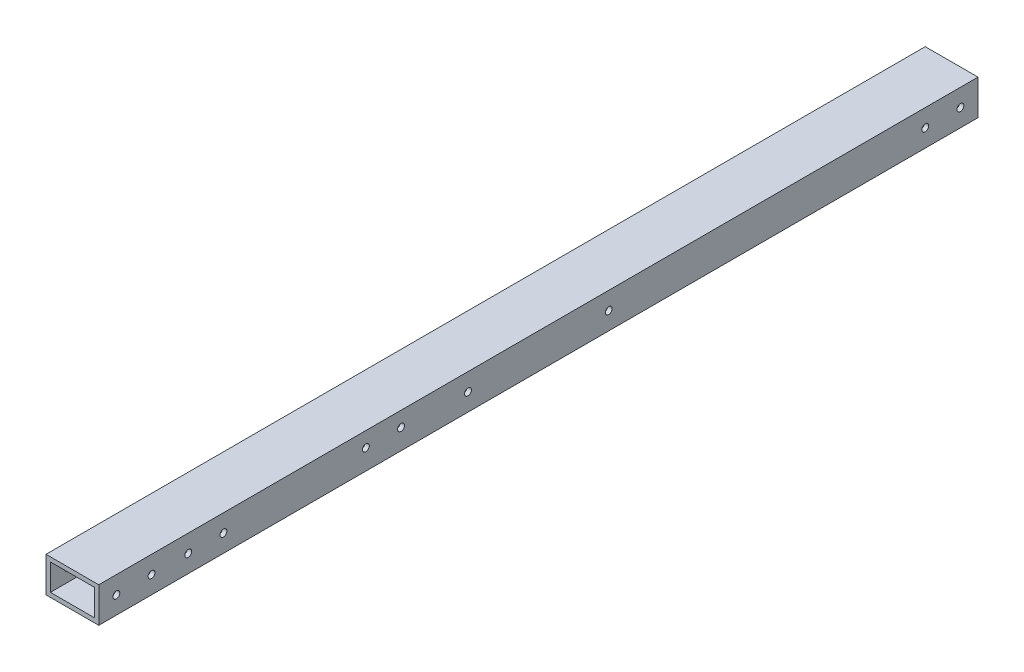
ISO-10303-21;
HEADER;
FILE_DESCRIPTION(('STEP AP214'),'2;1');
FILE_NAME('part.step','',(''),(''),'','','');
FILE_SCHEMA(('AUTOMOTIVE_DESIGN { 1 0 10303 214 1 1 1 1 }'));
ENDSEC;
DATA;
#1=APPLICATION_CONTEXT('core data for automotive mechanical design processes');
#2=APPLICATION_PROTOCOL_DEFINITION('international standard','automotive_design',2000,#1);
#3=PRODUCT_CONTEXT('',#1,'mechanical');
#4=PRODUCT('Part','Part','',(#3));
#5=PRODUCT_RELATED_PRODUCT_CATEGORY('part','',(#4));
#6=PRODUCT_DEFINITION_FORMATION('','',#4);
#7=PRODUCT_DEFINITION_CONTEXT('part definition',#1,'design');
#8=PRODUCT_DEFINITION('design','',#6,#7);
#9=PRODUCT_DEFINITION_SHAPE('','',#8);
#10=(LENGTH_UNIT() NAMED_UNIT(*) SI_UNIT(.MILLI.,.METRE.));
#11=(NAMED_UNIT(*) PLANE_ANGLE_UNIT() SI_UNIT($,.RADIAN.));
#12=(NAMED_UNIT(*) SI_UNIT($,.STERADIAN.) SOLID_ANGLE_UNIT());
#13=UNCERTAINTY_MEASURE_WITH_UNIT(LENGTH_MEASURE(1.E-05),#10,'distance_accuracy_value','');
#14=(GEOMETRIC_REPRESENTATION_CONTEXT(3) GLOBAL_UNCERTAINTY_ASSIGNED_CONTEXT((#13)) GLOBAL_UNIT_ASSIGNED_CONTEXT((#10,
#11,#12)) REPRESENTATION_CONTEXT('',''));
#15=CARTESIAN_POINT('',(0.,0.,0.));
#16=DIRECTION('',(0.,0.,1.));
#17=DIRECTION('',(1.,0.,0.));
#18=AXIS2_PLACEMENT_3D('',#15,#16,#17);
#19=CARTESIAN_POINT('',(0.,0.,317.499999492));
#20=DIRECTION('',(0.,0.,1.));
#21=DIRECTION('',(1.,0.,0.));
#22=AXIS2_PLACEMENT_3D('',#19,#20,#21);
#23=PLANE('',#22);
#24=DIRECTION('',(0.,-1.,0.));
#25=VECTOR('',#24,1.);
#26=CARTESIAN_POINT('',(-19.05,12.7,317.499999492));
#27=LINE('',#26,#25);
#28=CARTESIAN_POINT('',(-19.05,12.7,317.499999492));
#29=VERTEX_POINT('',#28);
#30=CARTESIAN_POINT('',(-19.05,-12.7,317.499999492));
#31=VERTEX_POINT('',#30);
#32=EDGE_CURVE('E125',#29,#31,#27,.T.);
#33=ORIENTED_EDGE('',*,*,#32,.T.);
#34=DIRECTION('',(1.,0.,0.));
#35=VECTOR('',#34,1.);
#36=CARTESIAN_POINT('',(-19.05,-12.7,317.499999492));
#37=LINE('',#36,#35);
#38=CARTESIAN_POINT('',(19.05,-12.7,317.499999492));
#39=VERTEX_POINT('',#38);
#40=EDGE_CURVE('E190',#31,#39,#37,.T.);
#41=ORIENTED_EDGE('',*,*,#40,.T.);
#42=DIRECTION('',(0.,1.,0.));
#43=VECTOR('',#42,1.);
#44=CARTESIAN_POINT('',(19.05,-12.7,317.499999492));
#45=LINE('',#44,#43);
#46=CARTESIAN_POINT('',(19.05,12.7,317.499999492));
#47=VERTEX_POINT('',#46);
#48=EDGE_CURVE('E193',#39,#47,#45,.T.);
#49=ORIENTED_EDGE('',*,*,#48,.T.);
#50=DIRECTION('',(-1.,0.,0.));
#51=VECTOR('',#50,1.);
#52=CARTESIAN_POINT('',(19.05,12.7,317.499999492));
#53=LINE('',#52,#51);
#54=EDGE_CURVE('E71',#47,#29,#53,.T.);
#55=ORIENTED_EDGE('',*,*,#54,.T.);
#56=EDGE_LOOP('',(#33,#41,#49,#55));
#57=FACE_BOUND('',#56,.T.);
#58=DIRECTION('',(1.,0.,0.));
#59=VECTOR('',#58,1.);
#60=CARTESIAN_POINT('',(-15.875,-9.525,317.499999492));
#61=LINE('',#60,#59);
#62=CARTESIAN_POINT('',(-15.875,-9.525,317.499999492));
#63=VERTEX_POINT('',#62);
#64=CARTESIAN_POINT('',(15.875,-9.525,317.499999492));
#65=VERTEX_POINT('',#64);
#66=EDGE_CURVE('E172',#63,#65,#61,.T.);
#67=ORIENTED_EDGE('',*,*,#66,.F.);
#68=DIRECTION('',(0.,-1.,0.));
#69=VECTOR('',#68,1.);
#70=CARTESIAN_POINT('',(-15.875,9.525,317.499999492));
#71=LINE('',#70,#69);
#72=CARTESIAN_POINT('',(-15.875,9.525,317.499999492));
#73=VERTEX_POINT('',#72);
#74=EDGE_CURVE('E121',#73,#63,#71,.T.);
#75=ORIENTED_EDGE('',*,*,#74,.F.);
#76=DIRECTION('',(-1.,0.,0.));
#77=VECTOR('',#76,1.);
#78=CARTESIAN_POINT('',(15.875,9.525,317.499999492));
#79=LINE('',#78,#77);
#80=CARTESIAN_POINT('',(15.875,9.525,317.499999492));
#81=VERTEX_POINT('',#80);
#82=EDGE_CURVE('E178',#81,#73,#79,.T.);
#83=ORIENTED_EDGE('',*,*,#82,.F.);
#84=DIRECTION('',(0.,1.,0.));
#85=VECTOR('',#84,1.);
#86=CARTESIAN_POINT('',(15.875,-9.525,317.499999492));
#87=LINE('',#86,#85);
#88=EDGE_CURVE('E175',#65,#81,#87,.T.);
#89=ORIENTED_EDGE('',*,*,#88,.F.);
#90=EDGE_LOOP('',(#67,#75,#83,#89));
#91=FACE_BOUND('',#90,.T.);
#92=ADVANCED_FACE('F45',(#57,#91),#23,.T.);
#93=CARTESIAN_POINT('',(-19.05,12.7,317.499999492));
#94=DIRECTION('',(1.,0.,0.));
#95=DIRECTION('',(0.,0.,-1.));
#96=AXIS2_PLACEMENT_3D('',#93,#94,#95);
#97=PLANE('',#96);
#98=CARTESIAN_POINT('',(-19.05,0.,-50.8));
#99=DIRECTION('',(-1.,0.,0.));
#100=DIRECTION('',(0.,0.,1.));
#101=AXIS2_PLACEMENT_3D('',#98,#99,#100);
#102=CIRCLE('',#101,2.48919999999999);
#103=CARTESIAN_POINT('',(-19.05,0.,-48.3108));
#104=VERTEX_POINT('',#103);
#105=EDGE_CURVE('E710',#104,#104,#102,.T.);
#106=ORIENTED_EDGE('',*,*,#105,.F.);
#107=EDGE_LOOP('',(#106));
#108=FACE_BOUND('',#107,.T.);
#109=CARTESIAN_POINT('',(-19.05,0.,50.8));
#110=DIRECTION('',(-1.,0.,0.));
#111=DIRECTION('',(0.,0.,1.));
#112=AXIS2_PLACEMENT_3D('',#109,#110,#111);
#113=CIRCLE('',#112,2.48919999999999);
#114=CARTESIAN_POINT('',(-19.05,0.,53.2892));
#115=VERTEX_POINT('',#114);
#116=EDGE_CURVE('E724',#115,#115,#113,.T.);
#117=ORIENTED_EDGE('',*,*,#116,.F.);
#118=EDGE_LOOP('',(#117));
#119=FACE_BOUND('',#118,.T.);
#120=CARTESIAN_POINT('',(-19.05,7.72651647523714E-09,252.85700050648));
#121=DIRECTION('',(1.,0.,0.));
#122=DIRECTION('',(0.,0.,-1.));
#123=AXIS2_PLACEMENT_3D('',#120,#121,#122);
#124=CIRCLE('',#123,2.48919999999999);
#125=CARTESIAN_POINT('',(-19.05,7.72651647523714E-09,250.367800506481));
#126=VERTEX_POINT('',#125);
#127=EDGE_CURVE('E249',#126,#126,#124,.T.);
#128=ORIENTED_EDGE('',*,*,#127,.T.);
#129=EDGE_LOOP('',(#128));
#130=FACE_BOUND('',#129,.T.);
#131=CARTESIAN_POINT('',(-19.05,1.0763115225465E-08,227.45700050648));
#132=DIRECTION('',(1.,0.,0.));
#133=DIRECTION('',(0.,0.,-1.));
#134=AXIS2_PLACEMENT_3D('',#131,#132,#133);
#135=CIRCLE('',#134,2.48919999999999);
#136=CARTESIAN_POINT('',(-19.05,1.0763115225465E-08,224.967800506481));
#137=VERTEX_POINT('',#136);
#138=EDGE_CURVE('E244',#137,#137,#135,.T.);
#139=ORIENTED_EDGE('',*,*,#138,.T.);
#140=EDGE_LOOP('',(#139));
#141=FACE_BOUND('',#140,.T.);
#142=CARTESIAN_POINT('',(-19.05,1.94340481842892,124.587000506713));
#143=DIRECTION('',(1.,0.,0.));
#144=DIRECTION('',(0.,0.,-1.));
#145=AXIS2_PLACEMENT_3D('',#142,#143,#144);
#146=CIRCLE('',#145,2.48919999999999);
#147=CARTESIAN_POINT('',(-19.05,1.94340481842892,122.097800506713));
#148=VERTEX_POINT('',#147);
#149=EDGE_CURVE('E239',#148,#148,#146,.T.);
#150=ORIENTED_EDGE('',*,*,#149,.T.);
#151=EDGE_LOOP('',(#150));
#152=FACE_BOUND('',#151,.T.);
#153=CARTESIAN_POINT('',(-19.05,1.94340482146555,99.1870005067131));
#154=DIRECTION('',(1.,0.,0.));
#155=DIRECTION('',(0.,0.,-1.));
#156=AXIS2_PLACEMENT_3D('',#153,#154,#155);
#157=CIRCLE('',#156,2.48919999999999);
#158=CARTESIAN_POINT('',(-19.05,1.94340482146555,96.6978005067131));
#159=VERTEX_POINT('',#158);
#160=EDGE_CURVE('E233',#159,#159,#157,.T.);
#161=ORIENTED_EDGE('',*,*,#160,.T.);
#162=EDGE_LOOP('',(#161));
#163=FACE_BOUND('',#162,.T.);
#164=CARTESIAN_POINT('',(-19.05,0.,-304.800000508));
#165=DIRECTION('',(-1.,0.,0.));
#166=DIRECTION('',(0.,0.,1.));
#167=AXIS2_PLACEMENT_3D('',#164,#165,#166);
#168=CIRCLE('',#167,2.4892);
#169=CARTESIAN_POINT('',(-19.05,0.,-302.310800508));
#170=VERTEX_POINT('',#169);
#171=EDGE_CURVE('E297',#170,#170,#168,.T.);
#172=ORIENTED_EDGE('',*,*,#171,.F.);
#173=EDGE_LOOP('',(#172));
#174=FACE_BOUND('',#173,.T.);
#175=CARTESIAN_POINT('',(-19.05,0.,-279.400000508));
#176=DIRECTION('',(-1.,0.,0.));
#177=DIRECTION('',(0.,0.,1.));
#178=AXIS2_PLACEMENT_3D('',#175,#176,#177);
#179=CIRCLE('',#178,2.4892);
#180=CARTESIAN_POINT('',(-19.05,0.,-276.910800508));
#181=VERTEX_POINT('',#180);
#182=EDGE_CURVE('E307',#181,#181,#179,.T.);
#183=ORIENTED_EDGE('',*,*,#182,.F.);
#184=EDGE_LOOP('',(#183));
#185=FACE_BOUND('',#184,.T.);
#186=CARTESIAN_POINT('',(-19.05,0.,279.399999492));
#187=DIRECTION('',(-1.,0.,0.));
#188=DIRECTION('',(0.,0.,1.));
#189=AXIS2_PLACEMENT_3D('',#186,#187,#188);
#190=CIRCLE('',#189,2.4892);
#191=CARTESIAN_POINT('',(-19.05,0.,281.889199492));
#192=VERTEX_POINT('',#191);
#193=EDGE_CURVE('E317',#192,#192,#190,.T.);
#194=ORIENTED_EDGE('',*,*,#193,.F.);
#195=EDGE_LOOP('',(#194));
#196=FACE_BOUND('',#195,.T.);
#197=CARTESIAN_POINT('',(-19.05,0.,304.799999492));
#198=DIRECTION('',(-1.,0.,0.));
#199=DIRECTION('',(0.,0.,1.));
#200=AXIS2_PLACEMENT_3D('',#197,#198,#199);
#201=CIRCLE('',#200,2.4892);
#202=CARTESIAN_POINT('',(-19.05,0.,307.289199492));
#203=VERTEX_POINT('',#202);
#204=EDGE_CURVE('E327',#203,#203,#201,.T.);
#205=ORIENTED_EDGE('',*,*,#204,.F.);
#206=EDGE_LOOP('',(#205));
#207=FACE_BOUND('',#206,.T.);
#208=DIRECTION('',(0.,0.,-1.));
#209=VECTOR('',#208,1.);
#210=CARTESIAN_POINT('',(-19.05,12.7,317.499999492));
#211=LINE('',#210,#209);
#212=CARTESIAN_POINT('',(-19.05,12.7,-317.499999492));
#213=VERTEX_POINT('',#212);
#214=EDGE_CURVE('E198',#29,#213,#211,.T.);
#215=ORIENTED_EDGE('',*,*,#214,.T.);
#216=DIRECTION('',(0.,-1.,0.));
#217=VECTOR('',#216,1.);
#218=CARTESIAN_POINT('',(-19.05,12.7,-317.499999492));
#219=LINE('',#218,#217);
#220=CARTESIAN_POINT('',(-19.05,-12.7,-317.499999492));
#221=VERTEX_POINT('',#220);
#222=EDGE_CURVE('E154',#213,#221,#219,.T.);
#223=ORIENTED_EDGE('',*,*,#222,.T.);
#224=DIRECTION('',(0.,0.,-1.));
#225=VECTOR('',#224,1.);
#226=CARTESIAN_POINT('',(-19.05,-12.7,317.499999492));
#227=LINE('',#226,#225);
#228=EDGE_CURVE('E11',#31,#221,#227,.T.);
#229=ORIENTED_EDGE('',*,*,#228,.F.);
#230=ORIENTED_EDGE('',*,*,#32,.F.);
#231=EDGE_LOOP('',(#215,#223,#229,#230));
#232=FACE_BOUND('',#231,.T.);
#233=ADVANCED_FACE('F47',(#108,#119,#130,#141,#152,#163,#174,#185,#196,#207,#232),#97,.F.);
#234=CARTESIAN_POINT('',(-19.05,-12.7,317.499999492));
#235=DIRECTION('',(0.,1.,0.));
#236=DIRECTION('',(0.,0.,1.));
#237=AXIS2_PLACEMENT_3D('',#234,#235,#236);
#238=PLANE('',#237);
#239=ORIENTED_EDGE('',*,*,#228,.T.);
#240=DIRECTION('',(1.,0.,0.));
#241=VECTOR('',#240,1.);
#242=CARTESIAN_POINT('',(-19.05,-12.7,-317.499999492));
#243=LINE('',#242,#241);
#244=CARTESIAN_POINT('',(19.05,-12.7,-317.499999492));
#245=VERTEX_POINT('',#244);
#246=EDGE_CURVE('E158',#221,#245,#243,.T.);
#247=ORIENTED_EDGE('',*,*,#246,.T.);
#248=DIRECTION('',(0.,0.,-1.));
#249=VECTOR('',#248,1.);
#250=CARTESIAN_POINT('',(19.05,-12.7,317.499999492));
#251=LINE('',#250,#249);
#252=EDGE_CURVE('E55',#39,#245,#251,.T.);
#253=ORIENTED_EDGE('',*,*,#252,.F.);
#254=ORIENTED_EDGE('',*,*,#40,.F.);
#255=EDGE_LOOP('',(#239,#247,#253,#254));
#256=FACE_BOUND('',#255,.T.);
#257=ADVANCED_FACE('F356',(#256),#238,.F.);
#258=CARTESIAN_POINT('',(19.05,-12.7,317.499999492));
#259=DIRECTION('',(-1.,0.,0.));
#260=DIRECTION('',(0.,-1.,0.));
#261=AXIS2_PLACEMENT_3D('',#258,#259,#260);
#262=PLANE('',#261);
#263=CARTESIAN_POINT('',(19.05,0.,-50.8));
#264=DIRECTION('',(-1.,0.,0.));
#265=DIRECTION('',(0.,0.,1.));
#266=AXIS2_PLACEMENT_3D('',#263,#264,#265);
#267=CIRCLE('',#266,2.48919999999998);
#268=CARTESIAN_POINT('',(19.05,0.,-48.3108));
#269=VERTEX_POINT('',#268);
#270=EDGE_CURVE('E712',#269,#269,#267,.T.);
#271=ORIENTED_EDGE('',*,*,#270,.T.);
#272=EDGE_LOOP('',(#271));
#273=FACE_BOUND('',#272,.T.);
#274=CARTESIAN_POINT('',(19.05,0.,50.8));
#275=DIRECTION('',(-1.,0.,0.));
#276=DIRECTION('',(0.,0.,1.));
#277=AXIS2_PLACEMENT_3D('',#274,#275,#276);
#278=CIRCLE('',#277,2.48919999999998);
#279=CARTESIAN_POINT('',(19.05,0.,53.2892));
#280=VERTEX_POINT('',#279);
#281=EDGE_CURVE('E728',#280,#280,#278,.T.);
#282=ORIENTED_EDGE('',*,*,#281,.T.);
#283=EDGE_LOOP('',(#282));
#284=FACE_BOUND('',#283,.T.);
#285=CARTESIAN_POINT('',(19.05,7.72651647523714E-09,252.85700050648));
#286=DIRECTION('',(1.,0.,0.));
#287=DIRECTION('',(0.,0.,-1.));
#288=AXIS2_PLACEMENT_3D('',#285,#286,#287);
#289=CIRCLE('',#288,2.4892);
#290=CARTESIAN_POINT('',(19.05,7.72651647523714E-09,250.367800506481));
#291=VERTEX_POINT('',#290);
#292=EDGE_CURVE('E258',#291,#291,#289,.T.);
#293=ORIENTED_EDGE('',*,*,#292,.F.);
#294=EDGE_LOOP('',(#293));
#295=FACE_BOUND('',#294,.T.);
#296=CARTESIAN_POINT('',(19.05,1.0763115225465E-08,227.45700050648));
#297=DIRECTION('',(1.,0.,0.));
#298=DIRECTION('',(0.,0.,-1.));
#299=AXIS2_PLACEMENT_3D('',#296,#297,#298);
#300=CIRCLE('',#299,2.4892);
#301=CARTESIAN_POINT('',(19.05,1.0763115225465E-08,224.967800506481));
#302=VERTEX_POINT('',#301);
#303=EDGE_CURVE('E255',#302,#302,#300,.T.);
#304=ORIENTED_EDGE('',*,*,#303,.F.);
#305=EDGE_LOOP('',(#304));
#306=FACE_BOUND('',#305,.T.);
#307=CARTESIAN_POINT('',(19.05,1.94340481842892,124.587000506713));
#308=DIRECTION('',(1.,0.,0.));
#309=DIRECTION('',(0.,0.,-1.));
#310=AXIS2_PLACEMENT_3D('',#307,#308,#309);
#311=CIRCLE('',#310,2.4892);
#312=CARTESIAN_POINT('',(19.05,1.94340481842892,122.097800506713));
#313=VERTEX_POINT('',#312);
#314=EDGE_CURVE('E277',#313,#313,#311,.T.);
#315=ORIENTED_EDGE('',*,*,#314,.F.);
#316=EDGE_LOOP('',(#315));
#317=FACE_BOUND('',#316,.T.);
#318=CARTESIAN_POINT('',(19.05,1.94340482146555,99.1870005067131));
#319=DIRECTION('',(1.,0.,0.));
#320=DIRECTION('',(0.,0.,-1.));
#321=AXIS2_PLACEMENT_3D('',#318,#319,#320);
#322=CIRCLE('',#321,2.4892);
#323=CARTESIAN_POINT('',(19.05,1.94340482146555,96.6978005067131));
#324=VERTEX_POINT('',#323);
#325=EDGE_CURVE('E287',#324,#324,#322,.T.);
#326=ORIENTED_EDGE('',*,*,#325,.F.);
#327=EDGE_LOOP('',(#326));
#328=FACE_BOUND('',#327,.T.);
#329=CARTESIAN_POINT('',(19.05,0.,-304.800000508));
#330=DIRECTION('',(-1.,0.,0.));
#331=DIRECTION('',(0.,0.,1.));
#332=AXIS2_PLACEMENT_3D('',#329,#330,#331);
#333=CIRCLE('',#332,2.48919999999999);
#334=CARTESIAN_POINT('',(19.05,0.,-302.310800508));
#335=VERTEX_POINT('',#334);
#336=EDGE_CURVE('E227',#335,#335,#333,.T.);
#337=ORIENTED_EDGE('',*,*,#336,.T.);
#338=EDGE_LOOP('',(#337));
#339=FACE_BOUND('',#338,.T.);
#340=CARTESIAN_POINT('',(19.05,0.,-279.400000508));
#341=DIRECTION('',(-1.,0.,0.));
#342=DIRECTION('',(0.,0.,1.));
#343=AXIS2_PLACEMENT_3D('',#340,#341,#342);
#344=CIRCLE('',#343,2.48919999999999);
#345=CARTESIAN_POINT('',(19.05,0.,-276.910800508));
#346=VERTEX_POINT('',#345);
#347=EDGE_CURVE('E221',#346,#346,#344,.T.);
#348=ORIENTED_EDGE('',*,*,#347,.T.);
#349=EDGE_LOOP('',(#348));
#350=FACE_BOUND('',#349,.T.);
#351=CARTESIAN_POINT('',(19.05,0.,279.399999492));
#352=DIRECTION('',(-1.,0.,0.));
#353=DIRECTION('',(0.,0.,1.));
#354=AXIS2_PLACEMENT_3D('',#351,#352,#353);
#355=CIRCLE('',#354,2.48919999999999);
#356=CARTESIAN_POINT('',(19.05,0.,281.889199492));
#357=VERTEX_POINT('',#356);
#358=EDGE_CURVE('E215',#357,#357,#355,.T.);
#359=ORIENTED_EDGE('',*,*,#358,.T.);
#360=EDGE_LOOP('',(#359));
#361=FACE_BOUND('',#360,.T.);
#362=CARTESIAN_POINT('',(19.05,0.,304.799999492));
#363=DIRECTION('',(-1.,0.,0.));
#364=DIRECTION('',(0.,0.,1.));
#365=AXIS2_PLACEMENT_3D('',#362,#363,#364);
#366=CIRCLE('',#365,2.48919999999999);
#367=CARTESIAN_POINT('',(19.05,0.,307.289199492));
#368=VERTEX_POINT('',#367);
#369=EDGE_CURVE('E209',#368,#368,#366,.T.);
#370=ORIENTED_EDGE('',*,*,#369,.T.);
#371=EDGE_LOOP('',(#370));
#372=FACE_BOUND('',#371,.T.);
#373=ORIENTED_EDGE('',*,*,#252,.T.);
#374=DIRECTION('',(0.,1.,0.));
#375=VECTOR('',#374,1.);
#376=CARTESIAN_POINT('',(19.05,-12.7,-317.499999492));
#377=LINE('',#376,#375);
#378=CARTESIAN_POINT('',(19.05,12.7,-317.499999492));
#379=VERTEX_POINT('',#378);
#380=EDGE_CURVE('E162',#245,#379,#377,.T.);
#381=ORIENTED_EDGE('',*,*,#380,.T.);
#382=DIRECTION('',(0.,0.,-1.));
#383=VECTOR('',#382,1.);
#384=CARTESIAN_POINT('',(19.05,12.7,317.499999492));
#385=LINE('',#384,#383);
#386=EDGE_CURVE('E201',#47,#379,#385,.T.);
#387=ORIENTED_EDGE('',*,*,#386,.F.);
#388=ORIENTED_EDGE('',*,*,#48,.F.);
#389=EDGE_LOOP('',(#373,#381,#387,#388));
#390=FACE_BOUND('',#389,.T.);
#391=ADVANCED_FACE('F334',(#273,#284,#295,#306,#317,#328,#339,#350,#361,#372,#390),#262,.F.);
#392=CARTESIAN_POINT('',(19.05,12.7,317.499999492));
#393=DIRECTION('',(0.,-1.,0.));
#394=DIRECTION('',(0.,0.,-1.));
#395=AXIS2_PLACEMENT_3D('',#392,#393,#394);
#396=PLANE('',#395);
#397=ORIENTED_EDGE('',*,*,#386,.T.);
#398=DIRECTION('',(-1.,0.,0.));
#399=VECTOR('',#398,1.);
#400=CARTESIAN_POINT('',(19.05,12.7,-317.499999492));
#401=LINE('',#400,#399);
#402=EDGE_CURVE('E166',#379,#213,#401,.T.);
#403=ORIENTED_EDGE('',*,*,#402,.T.);
#404=ORIENTED_EDGE('',*,*,#214,.F.);
#405=ORIENTED_EDGE('',*,*,#54,.F.);
#406=EDGE_LOOP('',(#397,#403,#404,#405));
#407=FACE_BOUND('',#406,.T.);
#408=ADVANCED_FACE('F362',(#407),#396,.F.);
#409=CARTESIAN_POINT('',(-15.875,9.525,317.499999492));
#410=DIRECTION('',(1.,0.,0.));
#411=DIRECTION('',(0.,1.,0.));
#412=AXIS2_PLACEMENT_3D('',#409,#410,#411);
#413=PLANE('',#412);
#414=CARTESIAN_POINT('',(-15.875,0.,-50.8));
#415=DIRECTION('',(1.,0.,0.));
#416=DIRECTION('',(0.,1.,0.));
#417=AXIS2_PLACEMENT_3D('',#414,#415,#416);
#418=CIRCLE('',#417,2.48919999999999);
#419=CARTESIAN_POINT('',(-15.875,2.48919999999998,-50.8));
#420=VERTEX_POINT('',#419);
#421=EDGE_CURVE('E707',#420,#420,#418,.T.);
#422=ORIENTED_EDGE('',*,*,#421,.F.);
#423=EDGE_LOOP('',(#422));
#424=FACE_BOUND('',#423,.T.);
#425=CARTESIAN_POINT('',(-15.875,0.,50.8));
#426=DIRECTION('',(1.,0.,0.));
#427=DIRECTION('',(0.,1.,0.));
#428=AXIS2_PLACEMENT_3D('',#425,#426,#427);
#429=CIRCLE('',#428,2.48919999999999);
#430=CARTESIAN_POINT('',(-15.875,2.48919999999999,50.8));
#431=VERTEX_POINT('',#430);
#432=EDGE_CURVE('E49',#431,#431,#429,.T.);
#433=ORIENTED_EDGE('',*,*,#432,.F.);
#434=EDGE_LOOP('',(#433));
#435=FACE_BOUND('',#434,.T.);
#436=CARTESIAN_POINT('',(-15.875,7.72651647523714E-09,252.85700050648));
#437=DIRECTION('',(1.,0.,0.));
#438=DIRECTION('',(0.,1.,0.));
#439=AXIS2_PLACEMENT_3D('',#436,#437,#438);
#440=CIRCLE('',#439,2.48919999999999);
#441=CARTESIAN_POINT('',(-15.875,2.48920000772651,252.85700050648));
#442=VERTEX_POINT('',#441);
#443=EDGE_CURVE('E248',#442,#442,#440,.T.);
#444=ORIENTED_EDGE('',*,*,#443,.F.);
#445=EDGE_LOOP('',(#444));
#446=FACE_BOUND('',#445,.T.);
#447=CARTESIAN_POINT('',(-15.875,1.0763115225465E-08,227.45700050648));
#448=DIRECTION('',(1.,0.,0.));
#449=DIRECTION('',(0.,1.,0.));
#450=AXIS2_PLACEMENT_3D('',#447,#448,#449);
#451=CIRCLE('',#450,2.48919999999999);
#452=CARTESIAN_POINT('',(-15.875,2.48920001076311,227.45700050648));
#453=VERTEX_POINT('',#452);
#454=EDGE_CURVE('E240',#453,#453,#451,.T.);
#455=ORIENTED_EDGE('',*,*,#454,.F.);
#456=EDGE_LOOP('',(#455));
#457=FACE_BOUND('',#456,.T.);
#458=CARTESIAN_POINT('',(-15.875,1.94340481842892,124.587000506713));
#459=DIRECTION('',(1.,0.,0.));
#460=DIRECTION('',(0.,1.,0.));
#461=AXIS2_PLACEMENT_3D('',#458,#459,#460);
#462=CIRCLE('',#461,2.48919999999999);
#463=CARTESIAN_POINT('',(-15.875,4.43260481842891,124.587000506713));
#464=VERTEX_POINT('',#463);
#465=EDGE_CURVE('E238',#464,#464,#462,.T.);
#466=ORIENTED_EDGE('',*,*,#465,.F.);
#467=EDGE_LOOP('',(#466));
#468=FACE_BOUND('',#467,.T.);
#469=CARTESIAN_POINT('',(-15.875,1.94340482146555,99.1870005067131));
#470=DIRECTION('',(1.,0.,0.));
#471=DIRECTION('',(0.,1.,0.));
#472=AXIS2_PLACEMENT_3D('',#469,#470,#471);
#473=CIRCLE('',#472,2.48919999999999);
#474=CARTESIAN_POINT('',(-15.875,4.43260482146554,99.1870005067131));
#475=VERTEX_POINT('',#474);
#476=EDGE_CURVE('E232',#475,#475,#473,.T.);
#477=ORIENTED_EDGE('',*,*,#476,.F.);
#478=EDGE_LOOP('',(#477));
#479=FACE_BOUND('',#478,.T.);
#480=CARTESIAN_POINT('',(-15.875,0.,-304.800000508));
#481=DIRECTION('',(1.,0.,0.));
#482=DIRECTION('',(0.,1.,0.));
#483=AXIS2_PLACEMENT_3D('',#480,#481,#482);
#484=CIRCLE('',#483,2.48919999999999);
#485=CARTESIAN_POINT('',(-15.875,2.48919999999999,-304.800000508));
#486=VERTEX_POINT('',#485);
#487=EDGE_CURVE('E226',#486,#486,#484,.T.);
#488=ORIENTED_EDGE('',*,*,#487,.F.);
#489=EDGE_LOOP('',(#488));
#490=FACE_BOUND('',#489,.T.);
#491=CARTESIAN_POINT('',(-15.875,0.,-279.400000508));
#492=DIRECTION('',(1.,0.,0.));
#493=DIRECTION('',(0.,1.,0.));
#494=AXIS2_PLACEMENT_3D('',#491,#492,#493);
#495=CIRCLE('',#494,2.48919999999999);
#496=CARTESIAN_POINT('',(-15.875,2.48919999999992,-279.400000508));
#497=VERTEX_POINT('',#496);
#498=EDGE_CURVE('E216',#497,#497,#495,.T.);
#499=ORIENTED_EDGE('',*,*,#498,.F.);
#500=EDGE_LOOP('',(#499));
#501=FACE_BOUND('',#500,.T.);
#502=CARTESIAN_POINT('',(-15.875,0.,279.399999492));
#503=DIRECTION('',(1.,0.,0.));
#504=DIRECTION('',(0.,1.,0.));
#505=AXIS2_PLACEMENT_3D('',#502,#503,#504);
#506=CIRCLE('',#505,2.48919999999999);
#507=CARTESIAN_POINT('',(-15.875,2.48919999999999,279.399999492));
#508=VERTEX_POINT('',#507);
#509=EDGE_CURVE('E210',#508,#508,#506,.T.);
#510=ORIENTED_EDGE('',*,*,#509,.F.);
#511=EDGE_LOOP('',(#510));
#512=FACE_BOUND('',#511,.T.);
#513=CARTESIAN_POINT('',(-15.875,0.,304.799999492));
#514=DIRECTION('',(1.,0.,0.));
#515=DIRECTION('',(0.,1.,0.));
#516=AXIS2_PLACEMENT_3D('',#513,#514,#515);
#517=CIRCLE('',#516,2.48919999999999);
#518=CARTESIAN_POINT('',(-15.875,2.48919999999999,304.799999492));
#519=VERTEX_POINT('',#518);
#520=EDGE_CURVE('E142',#519,#519,#517,.T.);
#521=ORIENTED_EDGE('',*,*,#520,.F.);
#522=EDGE_LOOP('',(#521));
#523=FACE_BOUND('',#522,.T.);
#524=DIRECTION('',(0.,0.,-1.));
#525=VECTOR('',#524,1.);
#526=CARTESIAN_POINT('',(-15.875,-9.525,317.499999492));
#527=LINE('',#526,#525);
#528=CARTESIAN_POINT('',(-15.875,-9.525,-317.499999492));
#529=VERTEX_POINT('',#528);
#530=EDGE_CURVE('E113',#63,#529,#527,.T.);
#531=ORIENTED_EDGE('',*,*,#530,.T.);
#532=DIRECTION('',(0.,-1.,0.));
#533=VECTOR('',#532,1.);
#534=CARTESIAN_POINT('',(-15.875,9.525,-317.499999492));
#535=LINE('',#534,#533);
#536=CARTESIAN_POINT('',(-15.875,9.525,-317.499999492));
#537=VERTEX_POINT('',#536);
#538=EDGE_CURVE('E118',#537,#529,#535,.T.);
#539=ORIENTED_EDGE('',*,*,#538,.F.);
#540=DIRECTION('',(0.,0.,-1.));
#541=VECTOR('',#540,1.);
#542=CARTESIAN_POINT('',(-15.875,9.525,317.499999492));
#543=LINE('',#542,#541);
#544=EDGE_CURVE('E181',#73,#537,#543,.T.);
#545=ORIENTED_EDGE('',*,*,#544,.F.);
#546=ORIENTED_EDGE('',*,*,#74,.T.);
#547=EDGE_LOOP('',(#531,#539,#545,#546));
#548=FACE_BOUND('',#547,.T.);
#549=ADVANCED_FACE('F115',(#424,#435,#446,#457,#468,#479,#490,#501,#512,#523,#548),#413,.T.);
#550=CARTESIAN_POINT('',(-15.875,-9.525,317.499999492));
#551=DIRECTION('',(0.,1.,0.));
#552=DIRECTION('',(0.,0.,1.));
#553=AXIS2_PLACEMENT_3D('',#550,#551,#552);
#554=PLANE('',#553);
#555=DIRECTION('',(0.,0.,-1.));
#556=VECTOR('',#555,1.);
#557=CARTESIAN_POINT('',(15.875,-9.525,317.499999492));
#558=LINE('',#557,#556);
#559=CARTESIAN_POINT('',(15.875,-9.525,-317.499999492));
#560=VERTEX_POINT('',#559);
#561=EDGE_CURVE('E126',#65,#560,#558,.T.);
#562=ORIENTED_EDGE('',*,*,#561,.T.);
#563=DIRECTION('',(1.,0.,0.));
#564=VECTOR('',#563,1.);
#565=CARTESIAN_POINT('',(-15.875,-9.525,-317.499999492));
#566=LINE('',#565,#564);
#567=EDGE_CURVE('E129',#529,#560,#566,.T.);
#568=ORIENTED_EDGE('',*,*,#567,.F.);
#569=ORIENTED_EDGE('',*,*,#530,.F.);
#570=ORIENTED_EDGE('',*,*,#66,.T.);
#571=EDGE_LOOP('',(#562,#568,#569,#570));
#572=FACE_BOUND('',#571,.T.);
#573=ADVANCED_FACE('F130',(#572),#554,.T.);
#574=CARTESIAN_POINT('',(15.875,-9.525,317.499999492));
#575=DIRECTION('',(-1.,0.,0.));
#576=DIRECTION('',(0.,-1.,0.));
#577=AXIS2_PLACEMENT_3D('',#574,#575,#576);
#578=PLANE('',#577);
#579=CARTESIAN_POINT('',(15.875,0.,-50.8));
#580=DIRECTION('',(-1.,0.,0.));
#581=DIRECTION('',(0.,-1.,0.));
#582=AXIS2_PLACEMENT_3D('',#579,#580,#581);
#583=CIRCLE('',#582,2.48919999999999);
#584=CARTESIAN_POINT('',(15.875,-2.48919999999999,-50.8));
#585=VERTEX_POINT('',#584);
#586=EDGE_CURVE('E720',#585,#585,#583,.T.);
#587=ORIENTED_EDGE('',*,*,#586,.F.);
#588=EDGE_LOOP('',(#587));
#589=FACE_BOUND('',#588,.T.);
#590=CARTESIAN_POINT('',(15.875,0.,50.8));
#591=DIRECTION('',(-1.,0.,0.));
#592=DIRECTION('',(0.,-1.,0.));
#593=AXIS2_PLACEMENT_3D('',#590,#591,#592);
#594=CIRCLE('',#593,2.48919999999999);
#595=CARTESIAN_POINT('',(15.875,-2.48919999999999,50.8));
#596=VERTEX_POINT('',#595);
#597=EDGE_CURVE('E264',#596,#596,#594,.T.);
#598=ORIENTED_EDGE('',*,*,#597,.F.);
#599=EDGE_LOOP('',(#598));
#600=FACE_BOUND('',#599,.T.);
#601=CARTESIAN_POINT('',(15.875,7.72651647523714E-09,252.85700050648));
#602=DIRECTION('',(-1.,0.,0.));
#603=DIRECTION('',(0.,-1.,0.));
#604=AXIS2_PLACEMENT_3D('',#601,#602,#603);
#605=CIRCLE('',#604,2.48919999999999);
#606=CARTESIAN_POINT('',(15.875,-2.48919999227348,252.85700050648));
#607=VERTEX_POINT('',#606);
#608=EDGE_CURVE('E245',#607,#607,#605,.T.);
#609=ORIENTED_EDGE('',*,*,#608,.F.);
#610=EDGE_LOOP('',(#609));
#611=FACE_BOUND('',#610,.T.);
#612=CARTESIAN_POINT('',(15.875,1.0763115225465E-08,227.45700050648));
#613=DIRECTION('',(-1.,0.,0.));
#614=DIRECTION('',(0.,-1.,0.));
#615=AXIS2_PLACEMENT_3D('',#612,#613,#614);
#616=CIRCLE('',#615,2.48919999999999);
#617=CARTESIAN_POINT('',(15.875,-2.48919998923688,227.45700050648));
#618=VERTEX_POINT('',#617);
#619=EDGE_CURVE('E243',#618,#618,#616,.T.);
#620=ORIENTED_EDGE('',*,*,#619,.F.);
#621=EDGE_LOOP('',(#620));
#622=FACE_BOUND('',#621,.T.);
#623=CARTESIAN_POINT('',(15.875,1.94340481842892,124.587000506713));
#624=DIRECTION('',(-1.,0.,0.));
#625=DIRECTION('',(0.,-1.,0.));
#626=AXIS2_PLACEMENT_3D('',#623,#624,#625);
#627=CIRCLE('',#626,2.48919999999999);
#628=CARTESIAN_POINT('',(15.875,-0.545795181571073,124.587000506713));
#629=VERTEX_POINT('',#628);
#630=EDGE_CURVE('E234',#629,#629,#627,.T.);
#631=ORIENTED_EDGE('',*,*,#630,.F.);
#632=EDGE_LOOP('',(#631));
#633=FACE_BOUND('',#632,.T.);
#634=CARTESIAN_POINT('',(15.875,1.94340482146555,99.1870005067131));
#635=DIRECTION('',(-1.,0.,0.));
#636=DIRECTION('',(0.,-1.,0.));
#637=AXIS2_PLACEMENT_3D('',#634,#635,#636);
#638=CIRCLE('',#637,2.48919999999999);
#639=CARTESIAN_POINT('',(15.875,-0.545795178534447,99.1870005067131));
#640=VERTEX_POINT('',#639);
#641=EDGE_CURVE('E228',#640,#640,#638,.T.);
#642=ORIENTED_EDGE('',*,*,#641,.F.);
#643=EDGE_LOOP('',(#642));
#644=FACE_BOUND('',#643,.T.);
#645=CARTESIAN_POINT('',(15.875,0.,-304.800000508));
#646=DIRECTION('',(-1.,0.,0.));
#647=DIRECTION('',(0.,-1.,0.));
#648=AXIS2_PLACEMENT_3D('',#645,#646,#647);
#649=CIRCLE('',#648,2.48919999999999);
#650=CARTESIAN_POINT('',(15.875,-2.48919999999999,-304.800000508));
#651=VERTEX_POINT('',#650);
#652=EDGE_CURVE('E222',#651,#651,#649,.T.);
#653=ORIENTED_EDGE('',*,*,#652,.F.);
#654=EDGE_LOOP('',(#653));
#655=FACE_BOUND('',#654,.T.);
#656=CARTESIAN_POINT('',(15.875,0.,-279.400000508));
#657=DIRECTION('',(-1.,0.,0.));
#658=DIRECTION('',(0.,-1.,0.));
#659=AXIS2_PLACEMENT_3D('',#656,#657,#658);
#660=CIRCLE('',#659,2.48919999999999);
#661=CARTESIAN_POINT('',(15.875,-2.48920000000007,-279.400000508));
#662=VERTEX_POINT('',#661);
#663=EDGE_CURVE('E220',#662,#662,#660,.T.);
#664=ORIENTED_EDGE('',*,*,#663,.F.);
#665=EDGE_LOOP('',(#664));
#666=FACE_BOUND('',#665,.T.);
#667=CARTESIAN_POINT('',(15.875,0.,279.399999492));
#668=DIRECTION('',(-1.,0.,0.));
#669=DIRECTION('',(0.,-1.,0.));
#670=AXIS2_PLACEMENT_3D('',#667,#668,#669);
#671=CIRCLE('',#670,2.48919999999999);
#672=CARTESIAN_POINT('',(15.875,-2.4892,279.399999492));
#673=VERTEX_POINT('',#672);
#674=EDGE_CURVE('E214',#673,#673,#671,.T.);
#675=ORIENTED_EDGE('',*,*,#674,.F.);
#676=EDGE_LOOP('',(#675));
#677=FACE_BOUND('',#676,.T.);
#678=CARTESIAN_POINT('',(15.875,0.,304.799999492));
#679=DIRECTION('',(-1.,0.,0.));
#680=DIRECTION('',(0.,-1.,0.));
#681=AXIS2_PLACEMENT_3D('',#678,#679,#680);
#682=CIRCLE('',#681,2.48919999999999);
#683=CARTESIAN_POINT('',(15.875,-2.4892,304.799999492));
#684=VERTEX_POINT('',#683);
#685=EDGE_CURVE('E146',#684,#684,#682,.T.);
#686=ORIENTED_EDGE('',*,*,#685,.F.);
#687=EDGE_LOOP('',(#686));
#688=FACE_BOUND('',#687,.T.);
#689=DIRECTION('',(0.,0.,-1.));
#690=VECTOR('',#689,1.);
#691=CARTESIAN_POINT('',(15.875,9.525,317.499999492));
#692=LINE('',#691,#690);
#693=CARTESIAN_POINT('',(15.875,9.525,-317.499999492));
#694=VERTEX_POINT('',#693);
#695=EDGE_CURVE('E63',#81,#694,#692,.T.);
#696=ORIENTED_EDGE('',*,*,#695,.T.);
#697=DIRECTION('',(0.,1.,0.));
#698=VECTOR('',#697,1.);
#699=CARTESIAN_POINT('',(15.875,-9.525,-317.499999492));
#700=LINE('',#699,#698);
#701=EDGE_CURVE('E136',#560,#694,#700,.T.);
#702=ORIENTED_EDGE('',*,*,#701,.F.);
#703=ORIENTED_EDGE('',*,*,#561,.F.);
#704=ORIENTED_EDGE('',*,*,#88,.T.);
#705=EDGE_LOOP('',(#696,#702,#703,#704));
#706=FACE_BOUND('',#705,.T.);
#707=ADVANCED_FACE('F405',(#589,#600,#611,#622,#633,#644,#655,#666,#677,#688,#706),#578,.T.);
#708=CARTESIAN_POINT('',(15.875,9.525,317.499999492));
#709=DIRECTION('',(0.,-1.,0.));
#710=DIRECTION('',(0.,0.,-1.));
#711=AXIS2_PLACEMENT_3D('',#708,#709,#710);
#712=PLANE('',#711);
#713=ORIENTED_EDGE('',*,*,#544,.T.);
#714=DIRECTION('',(-1.,0.,0.));
#715=VECTOR('',#714,1.);
#716=CARTESIAN_POINT('',(15.875,9.525,-317.499999492));
#717=LINE('',#716,#715);
#718=EDGE_CURVE('E140',#694,#537,#717,.T.);
#719=ORIENTED_EDGE('',*,*,#718,.F.);
#720=ORIENTED_EDGE('',*,*,#695,.F.);
#721=ORIENTED_EDGE('',*,*,#82,.T.);
#722=EDGE_LOOP('',(#713,#719,#720,#721));
#723=FACE_BOUND('',#722,.T.);
#724=ADVANCED_FACE('F348',(#723),#712,.T.);
#725=CARTESIAN_POINT('',(0.,0.,-317.499999492));
#726=DIRECTION('',(0.,0.,1.));
#727=DIRECTION('',(1.,0.,0.));
#728=AXIS2_PLACEMENT_3D('',#725,#726,#727);
#729=PLANE('',#728);
#730=ORIENTED_EDGE('',*,*,#718,.T.);
#731=ORIENTED_EDGE('',*,*,#538,.T.);
#732=ORIENTED_EDGE('',*,*,#567,.T.);
#733=ORIENTED_EDGE('',*,*,#701,.T.);
#734=EDGE_LOOP('',(#730,#731,#732,#733));
#735=FACE_BOUND('',#734,.T.);
#736=ORIENTED_EDGE('',*,*,#222,.F.);
#737=ORIENTED_EDGE('',*,*,#402,.F.);
#738=ORIENTED_EDGE('',*,*,#380,.F.);
#739=ORIENTED_EDGE('',*,*,#246,.F.);
#740=EDGE_LOOP('',(#736,#737,#738,#739));
#741=FACE_BOUND('',#740,.T.);
#742=ADVANCED_FACE('F138',(#735,#741),#729,.F.);
#743=CARTESIAN_POINT('',(-19.05,0.,304.799999492));
#744=DIRECTION('',(-1.,0.,0.));
#745=DIRECTION('',(0.,0.,1.));
#746=AXIS2_PLACEMENT_3D('',#743,#744,#745);
#747=CYLINDRICAL_SURFACE('',#746,2.48919999999999);
#748=ORIENTED_EDGE('',*,*,#685,.T.);
#749=EDGE_LOOP('',(#748));
#750=FACE_BOUND('',#749,.T.);
#751=ORIENTED_EDGE('',*,*,#369,.F.);
#752=EDGE_LOOP('',(#751));
#753=FACE_BOUND('',#752,.T.);
#754=ADVANCED_FACE('F337',(#750,#753),#747,.F.);
#755=ORIENTED_EDGE('',*,*,#520,.T.);
#756=EDGE_LOOP('',(#755));
#757=FACE_BOUND('',#756,.T.);
#758=ORIENTED_EDGE('',*,*,#204,.T.);
#759=EDGE_LOOP('',(#758));
#760=FACE_BOUND('',#759,.T.);
#761=ADVANCED_FACE('F339',(#757,#760),#747,.F.);
#762=CARTESIAN_POINT('',(-19.05,0.,279.399999492));
#763=DIRECTION('',(-1.,0.,0.));
#764=DIRECTION('',(0.,0.,1.));
#765=AXIS2_PLACEMENT_3D('',#762,#763,#764);
#766=CYLINDRICAL_SURFACE('',#765,2.48919999999999);
#767=ORIENTED_EDGE('',*,*,#509,.T.);
#768=EDGE_LOOP('',(#767));
#769=FACE_BOUND('',#768,.T.);
#770=ORIENTED_EDGE('',*,*,#193,.T.);
#771=EDGE_LOOP('',(#770));
#772=FACE_BOUND('',#771,.T.);
#773=ADVANCED_FACE('F346',(#769,#772),#766,.F.);
#774=ORIENTED_EDGE('',*,*,#674,.T.);
#775=EDGE_LOOP('',(#774));
#776=FACE_BOUND('',#775,.T.);
#777=ORIENTED_EDGE('',*,*,#358,.F.);
#778=EDGE_LOOP('',(#777));
#779=FACE_BOUND('',#778,.T.);
#780=ADVANCED_FACE('F446',(#776,#779),#766,.F.);
#781=CARTESIAN_POINT('',(-19.05,0.,-279.400000508));
#782=DIRECTION('',(-1.,0.,0.));
#783=DIRECTION('',(0.,0.,1.));
#784=AXIS2_PLACEMENT_3D('',#781,#782,#783);
#785=CYLINDRICAL_SURFACE('',#784,2.48919999999999);
#786=ORIENTED_EDGE('',*,*,#498,.T.);
#787=EDGE_LOOP('',(#786));
#788=FACE_BOUND('',#787,.T.);
#789=ORIENTED_EDGE('',*,*,#182,.T.);
#790=EDGE_LOOP('',(#789));
#791=FACE_BOUND('',#790,.T.);
#792=ADVANCED_FACE('F456',(#788,#791),#785,.F.);
#793=ORIENTED_EDGE('',*,*,#663,.T.);
#794=EDGE_LOOP('',(#793));
#795=FACE_BOUND('',#794,.T.);
#796=ORIENTED_EDGE('',*,*,#347,.F.);
#797=EDGE_LOOP('',(#796));
#798=FACE_BOUND('',#797,.T.);
#799=ADVANCED_FACE('F466',(#795,#798),#785,.F.);
#800=CARTESIAN_POINT('',(-19.05,0.,-304.800000508));
#801=DIRECTION('',(-1.,0.,0.));
#802=DIRECTION('',(0.,0.,1.));
#803=AXIS2_PLACEMENT_3D('',#800,#801,#802);
#804=CYLINDRICAL_SURFACE('',#803,2.48919999999999);
#805=ORIENTED_EDGE('',*,*,#652,.T.);
#806=EDGE_LOOP('',(#805));
#807=FACE_BOUND('',#806,.T.);
#808=ORIENTED_EDGE('',*,*,#336,.F.);
#809=EDGE_LOOP('',(#808));
#810=FACE_BOUND('',#809,.T.);
#811=ADVANCED_FACE('F477',(#807,#810),#804,.F.);
#812=ORIENTED_EDGE('',*,*,#487,.T.);
#813=EDGE_LOOP('',(#812));
#814=FACE_BOUND('',#813,.T.);
#815=ORIENTED_EDGE('',*,*,#171,.T.);
#816=EDGE_LOOP('',(#815));
#817=FACE_BOUND('',#816,.T.);
#818=ADVANCED_FACE('F487',(#814,#817),#804,.F.);
#819=CARTESIAN_POINT('',(19.05,1.94340482146555,99.1870005067131));
#820=DIRECTION('',(1.,0.,0.));
#821=DIRECTION('',(0.,0.,-1.));
#822=AXIS2_PLACEMENT_3D('',#819,#820,#821);
#823=CYLINDRICAL_SURFACE('',#822,2.48919999999999);
#824=ORIENTED_EDGE('',*,*,#641,.T.);
#825=EDGE_LOOP('',(#824));
#826=FACE_BOUND('',#825,.T.);
#827=ORIENTED_EDGE('',*,*,#325,.T.);
#828=EDGE_LOOP('',(#827));
#829=FACE_BOUND('',#828,.T.);
#830=ADVANCED_FACE('F498',(#826,#829),#823,.F.);
#831=ORIENTED_EDGE('',*,*,#476,.T.);
#832=EDGE_LOOP('',(#831));
#833=FACE_BOUND('',#832,.T.);
#834=ORIENTED_EDGE('',*,*,#160,.F.);
#835=EDGE_LOOP('',(#834));
#836=FACE_BOUND('',#835,.T.);
#837=ADVANCED_FACE('F508',(#833,#836),#823,.F.);
#838=CARTESIAN_POINT('',(19.05,1.94340481842892,124.587000506713));
#839=DIRECTION('',(1.,0.,0.));
#840=DIRECTION('',(0.,0.,-1.));
#841=AXIS2_PLACEMENT_3D('',#838,#839,#840);
#842=CYLINDRICAL_SURFACE('',#841,2.48919999999999);
#843=ORIENTED_EDGE('',*,*,#630,.T.);
#844=EDGE_LOOP('',(#843));
#845=FACE_BOUND('',#844,.T.);
#846=ORIENTED_EDGE('',*,*,#314,.T.);
#847=EDGE_LOOP('',(#846));
#848=FACE_BOUND('',#847,.T.);
#849=ADVANCED_FACE('F519',(#845,#848),#842,.F.);
#850=ORIENTED_EDGE('',*,*,#465,.T.);
#851=EDGE_LOOP('',(#850));
#852=FACE_BOUND('',#851,.T.);
#853=ORIENTED_EDGE('',*,*,#149,.F.);
#854=EDGE_LOOP('',(#853));
#855=FACE_BOUND('',#854,.T.);
#856=ADVANCED_FACE('F529',(#852,#855),#842,.F.);
#857=CARTESIAN_POINT('',(19.05,1.0763115225465E-08,227.45700050648));
#858=DIRECTION('',(1.,0.,0.));
#859=DIRECTION('',(0.,0.,-1.));
#860=AXIS2_PLACEMENT_3D('',#857,#858,#859);
#861=CYLINDRICAL_SURFACE('',#860,2.48919999999999);
#862=ORIENTED_EDGE('',*,*,#454,.T.);
#863=EDGE_LOOP('',(#862));
#864=FACE_BOUND('',#863,.T.);
#865=ORIENTED_EDGE('',*,*,#138,.F.);
#866=EDGE_LOOP('',(#865));
#867=FACE_BOUND('',#866,.T.);
#868=ADVANCED_FACE('F540',(#864,#867),#861,.F.);
#869=ORIENTED_EDGE('',*,*,#619,.T.);
#870=EDGE_LOOP('',(#869));
#871=FACE_BOUND('',#870,.T.);
#872=ORIENTED_EDGE('',*,*,#303,.T.);
#873=EDGE_LOOP('',(#872));
#874=FACE_BOUND('',#873,.T.);
#875=ADVANCED_FACE('F550',(#871,#874),#861,.F.);
#876=CARTESIAN_POINT('',(19.05,7.72651647523714E-09,252.85700050648));
#877=DIRECTION('',(1.,0.,0.));
#878=DIRECTION('',(0.,0.,-1.));
#879=AXIS2_PLACEMENT_3D('',#876,#877,#878);
#880=CYLINDRICAL_SURFACE('',#879,2.48919999999999);
#881=ORIENTED_EDGE('',*,*,#608,.T.);
#882=EDGE_LOOP('',(#881));
#883=FACE_BOUND('',#882,.T.);
#884=ORIENTED_EDGE('',*,*,#292,.T.);
#885=EDGE_LOOP('',(#884));
#886=FACE_BOUND('',#885,.T.);
#887=ADVANCED_FACE('F561',(#883,#886),#880,.F.);
#888=ORIENTED_EDGE('',*,*,#443,.T.);
#889=EDGE_LOOP('',(#888));
#890=FACE_BOUND('',#889,.T.);
#891=ORIENTED_EDGE('',*,*,#127,.F.);
#892=EDGE_LOOP('',(#891));
#893=FACE_BOUND('',#892,.T.);
#894=ADVANCED_FACE('F571',(#890,#893),#880,.F.);
#895=CARTESIAN_POINT('',(-19.05,0.,50.8));
#896=DIRECTION('',(-1.,0.,0.));
#897=DIRECTION('',(0.,0.,1.));
#898=AXIS2_PLACEMENT_3D('',#895,#896,#897);
#899=CYLINDRICAL_SURFACE('',#898,2.48919999999999);
#900=ORIENTED_EDGE('',*,*,#432,.T.);
#901=EDGE_LOOP('',(#900));
#902=FACE_BOUND('',#901,.T.);
#903=ORIENTED_EDGE('',*,*,#116,.T.);
#904=EDGE_LOOP('',(#903));
#905=FACE_BOUND('',#904,.T.);
#906=ADVANCED_FACE('F581',(#902,#905),#899,.F.);
#907=ORIENTED_EDGE('',*,*,#597,.T.);
#908=EDGE_LOOP('',(#907));
#909=FACE_BOUND('',#908,.T.);
#910=ORIENTED_EDGE('',*,*,#281,.F.);
#911=EDGE_LOOP('',(#910));
#912=FACE_BOUND('',#911,.T.);
#913=ADVANCED_FACE('F617',(#909,#912),#899,.F.);
#914=CARTESIAN_POINT('',(-19.05,0.,-50.8));
#915=DIRECTION('',(-1.,0.,0.));
#916=DIRECTION('',(0.,0.,1.));
#917=AXIS2_PLACEMENT_3D('',#914,#915,#916);
#918=CYLINDRICAL_SURFACE('',#917,2.48919999999999);
#919=ORIENTED_EDGE('',*,*,#586,.T.);
#920=EDGE_LOOP('',(#919));
#921=FACE_BOUND('',#920,.T.);
#922=ORIENTED_EDGE('',*,*,#270,.F.);
#923=EDGE_LOOP('',(#922));
#924=FACE_BOUND('',#923,.T.);
#925=ADVANCED_FACE('F628',(#921,#924),#918,.F.);
#926=ORIENTED_EDGE('',*,*,#421,.T.);
#927=EDGE_LOOP('',(#926));
#928=FACE_BOUND('',#927,.T.);
#929=ORIENTED_EDGE('',*,*,#105,.T.);
#930=EDGE_LOOP('',(#929));
#931=FACE_BOUND('',#930,.T.);
#932=ADVANCED_FACE('F638',(#928,#931),#918,.F.);
#933=CLOSED_SHELL('',(#92,#233,#257,#391,#408,#549,#573,#707,#724,#742,#754,#761,#773,#780,#792,
#799,#811,#818,#830,#837,#849,#856,#868,#875,#887,#894,#906,#913,#925,#932));
#934=MANIFOLD_SOLID_BREP('B2',#933);
#935=ADVANCED_BREP_SHAPE_REPRESENTATION('',(#18,#934),#14);
#936=SHAPE_DEFINITION_REPRESENTATION(#9,#935);
ENDSEC;
END-ISO-10303-21;
